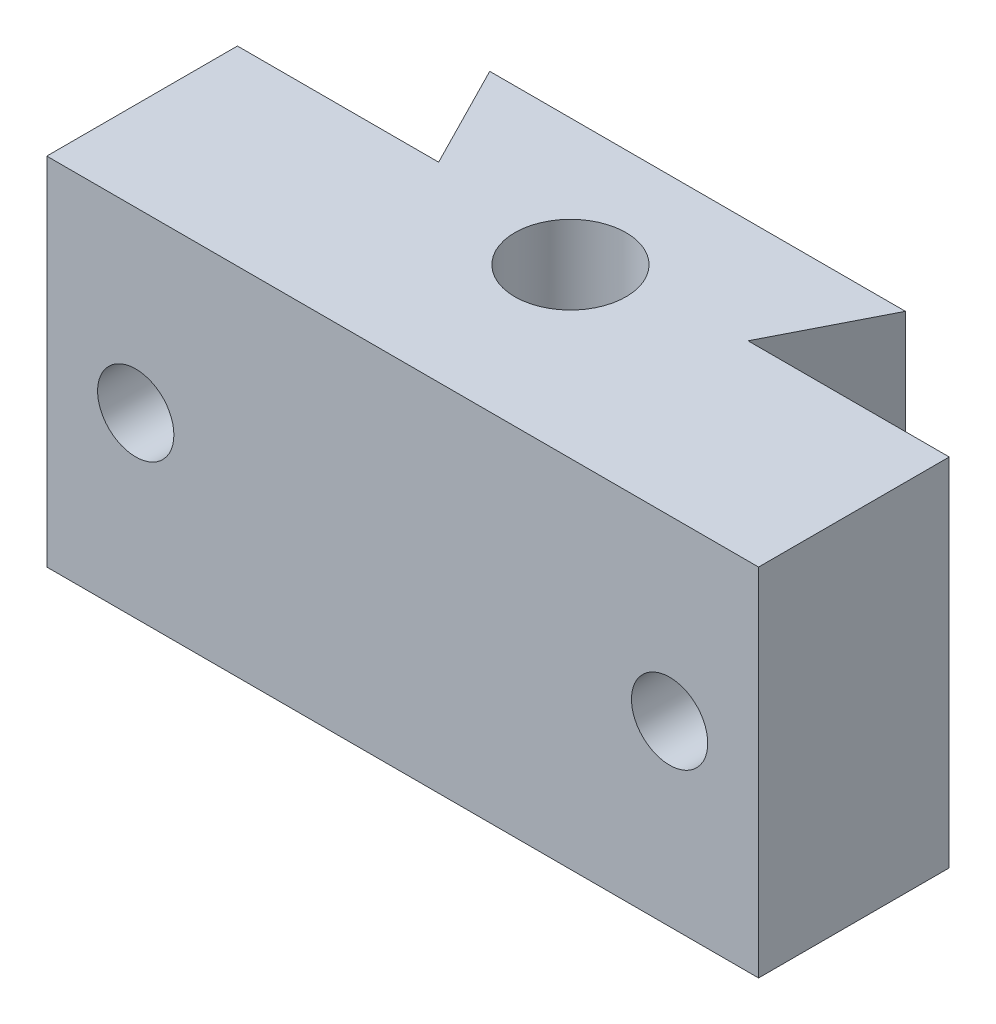
ISO-10303-21;
HEADER;
FILE_DESCRIPTION(('STEP AP214'),'2;1');
FILE_NAME('part.step','',(''),(''),'','','');
FILE_SCHEMA(('AUTOMOTIVE_DESIGN { 1 0 10303 214 1 1 1 1 }'));
ENDSEC;
DATA;
#1=APPLICATION_CONTEXT('core data for automotive mechanical design processes');
#2=APPLICATION_PROTOCOL_DEFINITION('international standard','automotive_design',2000,#1);
#3=PRODUCT_CONTEXT('',#1,'mechanical');
#4=PRODUCT('Part','Part','',(#3));
#5=PRODUCT_RELATED_PRODUCT_CATEGORY('part','',(#4));
#6=PRODUCT_DEFINITION_FORMATION('','',#4);
#7=PRODUCT_DEFINITION_CONTEXT('part definition',#1,'design');
#8=PRODUCT_DEFINITION('design','',#6,#7);
#9=PRODUCT_DEFINITION_SHAPE('','',#8);
#10=(LENGTH_UNIT() NAMED_UNIT(*) SI_UNIT(.MILLI.,.METRE.));
#11=(NAMED_UNIT(*) PLANE_ANGLE_UNIT() SI_UNIT($,.RADIAN.));
#12=(NAMED_UNIT(*) SI_UNIT($,.STERADIAN.) SOLID_ANGLE_UNIT());
#13=UNCERTAINTY_MEASURE_WITH_UNIT(LENGTH_MEASURE(1.E-05),#10,'distance_accuracy_value','');
#14=(GEOMETRIC_REPRESENTATION_CONTEXT(3) GLOBAL_UNCERTAINTY_ASSIGNED_CONTEXT((#13)) GLOBAL_UNIT_ASSIGNED_CONTEXT((#10,
#11,#12)) REPRESENTATION_CONTEXT('',''));
#15=CARTESIAN_POINT('',(0.,0.,0.));
#16=DIRECTION('',(0.,0.,1.));
#17=DIRECTION('',(1.,0.,0.));
#18=AXIS2_PLACEMENT_3D('',#15,#16,#17);
#19=CARTESIAN_POINT('',(0.,14.,-15.7));
#20=DIRECTION('',(0.,0.,-1.));
#21=DIRECTION('',(-1.,0.,0.));
#22=AXIS2_PLACEMENT_3D('',#19,#20,#21);
#23=PLANE('',#22);
#24=DIRECTION('',(1.,0.,0.));
#25=VECTOR('',#24,1.);
#26=CARTESIAN_POINT('',(0.,-14.,-15.7));
#27=LINE('',#26,#25);
#28=CARTESIAN_POINT('',(-16.35,-14.,-15.7));
#29=VERTEX_POINT('',#28);
#30=CARTESIAN_POINT('',(16.35,-14.,-15.7));
#31=VERTEX_POINT('',#30);
#32=EDGE_CURVE('E146',#29,#31,#27,.T.);
#33=ORIENTED_EDGE('',*,*,#32,.F.);
#34=DIRECTION('',(0.,-1.,0.));
#35=VECTOR('',#34,1.);
#36=CARTESIAN_POINT('',(-16.35,14.,-15.7));
#37=LINE('',#36,#35);
#38=CARTESIAN_POINT('',(-16.35,14.,-15.7));
#39=VERTEX_POINT('',#38);
#40=EDGE_CURVE('E43',#39,#29,#37,.T.);
#41=ORIENTED_EDGE('',*,*,#40,.F.);
#42=DIRECTION('',(1.,0.,0.));
#43=VECTOR('',#42,1.);
#44=CARTESIAN_POINT('',(0.,14.,-15.7));
#45=LINE('',#44,#43);
#46=CARTESIAN_POINT('',(16.35,14.,-15.7));
#47=VERTEX_POINT('',#46);
#48=EDGE_CURVE('E219',#39,#47,#45,.T.);
#49=ORIENTED_EDGE('',*,*,#48,.T.);
#50=DIRECTION('',(0.,-1.,0.));
#51=VECTOR('',#50,1.);
#52=CARTESIAN_POINT('',(16.35,14.,-15.7));
#53=LINE('',#52,#51);
#54=EDGE_CURVE('E11',#47,#31,#53,.T.);
#55=ORIENTED_EDGE('',*,*,#54,.T.);
#56=EDGE_LOOP('',(#33,#41,#49,#55));
#57=FACE_BOUND('',#56,.T.);
#58=DIRECTION('',(0.,-1.,0.));
#59=VECTOR('',#58,1.);
#60=CARTESIAN_POINT('',(7.50555349946514,3.375,-15.7));
#61=LINE('',#60,#59);
#62=CARTESIAN_POINT('',(7.50555349946514,3.375,-15.7));
#63=VERTEX_POINT('',#62);
#64=CARTESIAN_POINT('',(7.50555349946514,-3.375,-15.7));
#65=VERTEX_POINT('',#64);
#66=EDGE_CURVE('E178',#63,#65,#61,.T.);
#67=ORIENTED_EDGE('',*,*,#66,.F.);
#68=DIRECTION('',(1.,0.,0.));
#69=VECTOR('',#68,1.);
#70=CARTESIAN_POINT('',(7.50555349946514,3.375,-15.7));
#71=LINE('',#70,#69);
#72=CARTESIAN_POINT('',(-7.50555349946514,3.375,-15.7));
#73=VERTEX_POINT('',#72);
#74=EDGE_CURVE('E478',#73,#63,#71,.T.);
#75=ORIENTED_EDGE('',*,*,#74,.F.);
#76=DIRECTION('',(0.,-1.,0.));
#77=VECTOR('',#76,1.);
#78=CARTESIAN_POINT('',(-7.50555349946514,3.375,-15.7));
#79=LINE('',#78,#77);
#80=CARTESIAN_POINT('',(-7.50555349946514,-3.375,-15.7));
#81=VERTEX_POINT('',#80);
#82=EDGE_CURVE('E184',#73,#81,#79,.T.);
#83=ORIENTED_EDGE('',*,*,#82,.T.);
#84=DIRECTION('',(1.,0.,0.));
#85=VECTOR('',#84,1.);
#86=CARTESIAN_POINT('',(7.50555349946514,-3.375,-15.7));
#87=LINE('',#86,#85);
#88=EDGE_CURVE('E460',#81,#65,#87,.T.);
#89=ORIENTED_EDGE('',*,*,#88,.T.);
#90=EDGE_LOOP('',(#67,#75,#83,#89));
#91=FACE_BOUND('',#90,.T.);
#92=ADVANCED_FACE('F34',(#57,#91),#23,.T.);
#93=CARTESIAN_POINT('',(0.,-14.,-5.7));
#94=DIRECTION('',(0.,1.,0.));
#95=DIRECTION('',(0.,0.,1.));
#96=AXIS2_PLACEMENT_3D('',#93,#94,#95);
#97=CYLINDRICAL_SURFACE('',#96,4.375);
#98=CARTESIAN_POINT('',(0.,14.,-5.7));
#99=DIRECTION('',(0.,1.,0.));
#100=DIRECTION('',(0.,0.,1.));
#101=AXIS2_PLACEMENT_3D('',#98,#99,#100);
#102=CIRCLE('',#101,4.375);
#103=CARTESIAN_POINT('',(0.,14.,-1.325));
#104=VERTEX_POINT('',#103);
#105=EDGE_CURVE('E208',#104,#104,#102,.T.);
#106=ORIENTED_EDGE('',*,*,#105,.T.);
#107=EDGE_LOOP('',(#106));
#108=FACE_BOUND('',#107,.T.);
#109=CARTESIAN_POINT('',(0.,3.375,-5.7));
#110=DIRECTION('',(0.,-1.,0.));
#111=DIRECTION('',(0.,0.,-1.));
#112=AXIS2_PLACEMENT_3D('',#109,#110,#111);
#113=CIRCLE('',#112,4.375);
#114=CARTESIAN_POINT('',(0.,3.375,-10.075));
#115=VERTEX_POINT('',#114);
#116=EDGE_CURVE('E38',#115,#115,#113,.F.);
#117=ORIENTED_EDGE('',*,*,#116,.F.);
#118=EDGE_LOOP('',(#117));
#119=FACE_BOUND('',#118,.T.);
#120=ADVANCED_FACE('F257',(#108,#119),#97,.F.);
#121=CARTESIAN_POINT('',(6.62936103164753,14.,3.3778281595111));
#122=DIRECTION('',(0.891006524188366,0.,0.453990499739551));
#123=DIRECTION('',(0.453990499739551,0.,-0.891006524188366));
#124=AXIS2_PLACEMENT_3D('',#121,#122,#123);
#125=PLANE('',#124);
#126=DIRECTION('',(-0.453990499739551,0.,0.891006524188366));
#127=VECTOR('',#126,1.);
#128=CARTESIAN_POINT('',(6.62936103164753,-14.,3.3778281595111));
#129=LINE('',#128,#127);
#130=CARTESIAN_POINT('',(12.1718913141456,-14.,-7.5));
#131=VERTEX_POINT('',#130);
#132=EDGE_CURVE('E144',#31,#131,#129,.T.);
#133=ORIENTED_EDGE('',*,*,#132,.F.);
#134=ORIENTED_EDGE('',*,*,#54,.F.);
#135=DIRECTION('',(-0.453990499739551,0.,0.891006524188366));
#136=VECTOR('',#135,1.);
#137=CARTESIAN_POINT('',(6.62936103164753,14.,3.3778281595111));
#138=LINE('',#137,#136);
#139=CARTESIAN_POINT('',(12.1718913141456,14.,-7.5));
#140=VERTEX_POINT('',#139);
#141=EDGE_CURVE('E217',#47,#140,#138,.T.);
#142=ORIENTED_EDGE('',*,*,#141,.T.);
#143=DIRECTION('',(0.,-1.,0.));
#144=VECTOR('',#143,1.);
#145=CARTESIAN_POINT('',(12.1718913141456,14.,-7.5));
#146=LINE('',#145,#144);
#147=EDGE_CURVE('E60',#140,#131,#146,.T.);
#148=ORIENTED_EDGE('',*,*,#147,.T.);
#149=EDGE_LOOP('',(#133,#134,#142,#148));
#150=FACE_BOUND('',#149,.T.);
#151=ADVANCED_FACE('F36',(#150),#125,.T.);
#152=CARTESIAN_POINT('',(-6.62936103164753,14.,3.3778281595111));
#153=DIRECTION('',(-0.891006524188366,0.,0.453990499739551));
#154=DIRECTION('',(0.453990499739551,0.,0.891006524188366));
#155=AXIS2_PLACEMENT_3D('',#152,#153,#154);
#156=PLANE('',#155);
#157=DIRECTION('',(-0.453990499739551,0.,-0.891006524188366));
#158=VECTOR('',#157,1.);
#159=CARTESIAN_POINT('',(-6.62936103164753,-14.,3.3778281595111));
#160=LINE('',#159,#158);
#161=CARTESIAN_POINT('',(-12.1718913141456,-14.,-7.5));
#162=VERTEX_POINT('',#161);
#163=EDGE_CURVE('E150',#162,#29,#160,.T.);
#164=ORIENTED_EDGE('',*,*,#163,.F.);
#165=DIRECTION('',(0.,-1.,0.));
#166=VECTOR('',#165,1.);
#167=CARTESIAN_POINT('',(-12.1718913141456,14.,-7.5));
#168=LINE('',#167,#166);
#169=CARTESIAN_POINT('',(-12.1718913141456,14.,-7.5));
#170=VERTEX_POINT('',#169);
#171=EDGE_CURVE('E168',#170,#162,#168,.T.);
#172=ORIENTED_EDGE('',*,*,#171,.F.);
#173=DIRECTION('',(-0.453990499739551,0.,-0.891006524188366));
#174=VECTOR('',#173,1.);
#175=CARTESIAN_POINT('',(-6.62936103164753,14.,3.3778281595111));
#176=LINE('',#175,#174);
#177=EDGE_CURVE('E222',#170,#39,#176,.T.);
#178=ORIENTED_EDGE('',*,*,#177,.T.);
#179=ORIENTED_EDGE('',*,*,#40,.T.);
#180=EDGE_LOOP('',(#164,#172,#178,#179));
#181=FACE_BOUND('',#180,.T.);
#182=ADVANCED_FACE('F240',(#181),#156,.T.);
#183=CARTESIAN_POINT('',(0.,14.,-7.5));
#184=DIRECTION('',(0.,0.,-1.));
#185=DIRECTION('',(-1.,0.,0.));
#186=AXIS2_PLACEMENT_3D('',#183,#184,#185);
#187=PLANE('',#186);
#188=CARTESIAN_POINT('',(-21.,0.,-7.5));
#189=DIRECTION('',(0.,0.,-1.));
#190=DIRECTION('',(-1.,0.,0.));
#191=AXIS2_PLACEMENT_3D('',#188,#189,#190);
#192=CIRCLE('',#191,3.);
#193=CARTESIAN_POINT('',(-18.,0.,-7.5));
#194=VERTEX_POINT('',#193);
#195=EDGE_CURVE('E204',#194,#194,#192,.F.);
#196=ORIENTED_EDGE('',*,*,#195,.T.);
#197=EDGE_LOOP('',(#196));
#198=FACE_BOUND('',#197,.T.);
#199=DIRECTION('',(1.,0.,0.));
#200=VECTOR('',#199,1.);
#201=CARTESIAN_POINT('',(0.,-14.,-7.5));
#202=LINE('',#201,#200);
#203=CARTESIAN_POINT('',(-28.,-14.,-7.5));
#204=VERTEX_POINT('',#203);
#205=EDGE_CURVE('E153',#204,#162,#202,.T.);
#206=ORIENTED_EDGE('',*,*,#205,.F.);
#207=DIRECTION('',(0.,-1.,0.));
#208=VECTOR('',#207,1.);
#209=CARTESIAN_POINT('',(-28.,14.,-7.5));
#210=LINE('',#209,#208);
#211=CARTESIAN_POINT('',(-28.,14.,-7.5));
#212=VERTEX_POINT('',#211);
#213=EDGE_CURVE('E166',#212,#204,#210,.T.);
#214=ORIENTED_EDGE('',*,*,#213,.F.);
#215=DIRECTION('',(1.,0.,0.));
#216=VECTOR('',#215,1.);
#217=CARTESIAN_POINT('',(0.,14.,-7.5));
#218=LINE('',#217,#216);
#219=EDGE_CURVE('E141',#212,#170,#218,.T.);
#220=ORIENTED_EDGE('',*,*,#219,.T.);
#221=ORIENTED_EDGE('',*,*,#171,.T.);
#222=EDGE_LOOP('',(#206,#214,#220,#221));
#223=FACE_BOUND('',#222,.T.);
#224=ADVANCED_FACE('F242',(#198,#223),#187,.T.);
#225=CARTESIAN_POINT('',(-28.,14.,0.));
#226=DIRECTION('',(-1.,0.,0.));
#227=DIRECTION('',(0.,0.,1.));
#228=AXIS2_PLACEMENT_3D('',#225,#226,#227);
#229=PLANE('',#228);
#230=DIRECTION('',(0.,0.,-1.));
#231=VECTOR('',#230,1.);
#232=CARTESIAN_POINT('',(-28.,-14.,0.));
#233=LINE('',#232,#231);
#234=CARTESIAN_POINT('',(-28.,-14.,7.5));
#235=VERTEX_POINT('',#234);
#236=EDGE_CURVE('E156',#235,#204,#233,.T.);
#237=ORIENTED_EDGE('',*,*,#236,.F.);
#238=DIRECTION('',(0.,-1.,0.));
#239=VECTOR('',#238,1.);
#240=CARTESIAN_POINT('',(-28.,14.,7.5));
#241=LINE('',#240,#239);
#242=CARTESIAN_POINT('',(-28.,14.,7.5));
#243=VERTEX_POINT('',#242);
#244=EDGE_CURVE('E134',#243,#235,#241,.T.);
#245=ORIENTED_EDGE('',*,*,#244,.F.);
#246=DIRECTION('',(0.,0.,-1.));
#247=VECTOR('',#246,1.);
#248=CARTESIAN_POINT('',(-28.,14.,0.));
#249=LINE('',#248,#247);
#250=EDGE_CURVE('E123',#243,#212,#249,.T.);
#251=ORIENTED_EDGE('',*,*,#250,.T.);
#252=ORIENTED_EDGE('',*,*,#213,.T.);
#253=EDGE_LOOP('',(#237,#245,#251,#252));
#254=FACE_BOUND('',#253,.T.);
#255=ADVANCED_FACE('F227',(#254),#229,.T.);
#256=CARTESIAN_POINT('',(0.,14.,7.5));
#257=DIRECTION('',(0.,0.,-1.));
#258=DIRECTION('',(-1.,0.,0.));
#259=AXIS2_PLACEMENT_3D('',#256,#257,#258);
#260=PLANE('',#259);
#261=CARTESIAN_POINT('',(-21.,0.,7.5));
#262=DIRECTION('',(0.,0.,1.));
#263=DIRECTION('',(1.,0.,0.));
#264=AXIS2_PLACEMENT_3D('',#261,#262,#263);
#265=CIRCLE('',#264,3.);
#266=CARTESIAN_POINT('',(-18.,0.,7.5));
#267=VERTEX_POINT('',#266);
#268=EDGE_CURVE('E201',#267,#267,#265,.T.);
#269=ORIENTED_EDGE('',*,*,#268,.F.);
#270=EDGE_LOOP('',(#269));
#271=FACE_BOUND('',#270,.T.);
#272=CARTESIAN_POINT('',(21.,0.,7.5));
#273=DIRECTION('',(0.,0.,1.));
#274=DIRECTION('',(1.,0.,0.));
#275=AXIS2_PLACEMENT_3D('',#272,#273,#274);
#276=CIRCLE('',#275,3.);
#277=CARTESIAN_POINT('',(24.,0.,7.5));
#278=VERTEX_POINT('',#277);
#279=EDGE_CURVE('E176',#278,#278,#276,.T.);
#280=ORIENTED_EDGE('',*,*,#279,.F.);
#281=EDGE_LOOP('',(#280));
#282=FACE_BOUND('',#281,.T.);
#283=DIRECTION('',(1.,0.,0.));
#284=VECTOR('',#283,1.);
#285=CARTESIAN_POINT('',(0.,-14.,7.5));
#286=LINE('',#285,#284);
#287=CARTESIAN_POINT('',(28.,-14.,7.5));
#288=VERTEX_POINT('',#287);
#289=EDGE_CURVE('E130',#235,#288,#286,.T.);
#290=ORIENTED_EDGE('',*,*,#289,.T.);
#291=DIRECTION('',(0.,-1.,0.));
#292=VECTOR('',#291,1.);
#293=CARTESIAN_POINT('',(28.,14.,7.5));
#294=LINE('',#293,#292);
#295=CARTESIAN_POINT('',(28.,14.,7.5));
#296=VERTEX_POINT('',#295);
#297=EDGE_CURVE('E127',#296,#288,#294,.T.);
#298=ORIENTED_EDGE('',*,*,#297,.F.);
#299=DIRECTION('',(1.,0.,0.));
#300=VECTOR('',#299,1.);
#301=CARTESIAN_POINT('',(0.,14.,7.5));
#302=LINE('',#301,#300);
#303=EDGE_CURVE('E114',#243,#296,#302,.T.);
#304=ORIENTED_EDGE('',*,*,#303,.F.);
#305=ORIENTED_EDGE('',*,*,#244,.T.);
#306=EDGE_LOOP('',(#290,#298,#304,#305));
#307=FACE_BOUND('',#306,.T.);
#308=ADVANCED_FACE('F128',(#271,#282,#307),#260,.F.);
#309=CARTESIAN_POINT('',(28.,14.,0.));
#310=DIRECTION('',(-1.,0.,0.));
#311=DIRECTION('',(0.,0.,1.));
#312=AXIS2_PLACEMENT_3D('',#309,#310,#311);
#313=PLANE('',#312);
#314=DIRECTION('',(0.,0.,-1.));
#315=VECTOR('',#314,1.);
#316=CARTESIAN_POINT('',(28.,-14.,0.));
#317=LINE('',#316,#315);
#318=CARTESIAN_POINT('',(28.,-14.,-7.5));
#319=VERTEX_POINT('',#318);
#320=EDGE_CURVE('E161',#288,#319,#317,.T.);
#321=ORIENTED_EDGE('',*,*,#320,.T.);
#322=DIRECTION('',(0.,-1.,0.));
#323=VECTOR('',#322,1.);
#324=CARTESIAN_POINT('',(28.,14.,-7.5));
#325=LINE('',#324,#323);
#326=CARTESIAN_POINT('',(28.,14.,-7.5));
#327=VERTEX_POINT('',#326);
#328=EDGE_CURVE('E135',#327,#319,#325,.T.);
#329=ORIENTED_EDGE('',*,*,#328,.F.);
#330=DIRECTION('',(0.,0.,-1.));
#331=VECTOR('',#330,1.);
#332=CARTESIAN_POINT('',(28.,14.,0.));
#333=LINE('',#332,#331);
#334=EDGE_CURVE('E119',#296,#327,#333,.T.);
#335=ORIENTED_EDGE('',*,*,#334,.F.);
#336=ORIENTED_EDGE('',*,*,#297,.T.);
#337=EDGE_LOOP('',(#321,#329,#335,#336));
#338=FACE_BOUND('',#337,.T.);
#339=ADVANCED_FACE('F137',(#338),#313,.F.);
#340=CARTESIAN_POINT('',(21.,0.,-7.5));
#341=DIRECTION('',(0.,0.,-1.));
#342=DIRECTION('',(-1.,0.,0.));
#343=AXIS2_PLACEMENT_3D('',#340,#341,#342);
#344=CIRCLE('',#343,3.);
#345=CARTESIAN_POINT('',(24.,0.,-7.5));
#346=VERTEX_POINT('',#345);
#347=EDGE_CURVE('E205',#346,#346,#344,.F.);
#348=ORIENTED_EDGE('',*,*,#347,.T.);
#349=EDGE_LOOP('',(#348));
#350=FACE_BOUND('',#349,.T.);
#351=EDGE_CURVE('E157',#131,#319,#202,.T.);
#352=ORIENTED_EDGE('',*,*,#351,.F.);
#353=ORIENTED_EDGE('',*,*,#147,.F.);
#354=EDGE_CURVE('E138',#140,#327,#218,.T.);
#355=ORIENTED_EDGE('',*,*,#354,.T.);
#356=ORIENTED_EDGE('',*,*,#328,.T.);
#357=EDGE_LOOP('',(#352,#353,#355,#356));
#358=FACE_BOUND('',#357,.T.);
#359=ADVANCED_FACE('F232',(#350,#358),#187,.T.);
#360=CARTESIAN_POINT('',(0.,14.,0.));
#361=DIRECTION('',(0.,1.,0.));
#362=DIRECTION('',(0.,0.,1.));
#363=AXIS2_PLACEMENT_3D('',#360,#361,#362);
#364=PLANE('',#363);
#365=ORIENTED_EDGE('',*,*,#105,.F.);
#366=EDGE_LOOP('',(#365));
#367=FACE_BOUND('',#366,.T.);
#368=ORIENTED_EDGE('',*,*,#141,.F.);
#369=ORIENTED_EDGE('',*,*,#48,.F.);
#370=ORIENTED_EDGE('',*,*,#177,.F.);
#371=ORIENTED_EDGE('',*,*,#219,.F.);
#372=ORIENTED_EDGE('',*,*,#250,.F.);
#373=ORIENTED_EDGE('',*,*,#303,.T.);
#374=ORIENTED_EDGE('',*,*,#334,.T.);
#375=ORIENTED_EDGE('',*,*,#354,.F.);
#376=EDGE_LOOP('',(#368,#369,#370,#371,#372,#373,#374,#375));
#377=FACE_BOUND('',#376,.T.);
#378=ADVANCED_FACE('F116',(#367,#377),#364,.T.);
#379=CARTESIAN_POINT('',(0.,-14.,0.));
#380=DIRECTION('',(0.,1.,0.));
#381=DIRECTION('',(0.,0.,1.));
#382=AXIS2_PLACEMENT_3D('',#379,#380,#381);
#383=PLANE('',#382);
#384=CARTESIAN_POINT('',(0.,-14.,-5.7));
#385=DIRECTION('',(0.,1.,0.));
#386=DIRECTION('',(0.,0.,1.));
#387=AXIS2_PLACEMENT_3D('',#384,#385,#386);
#388=CIRCLE('',#387,4.375);
#389=CARTESIAN_POINT('',(0.,-14.,-1.325));
#390=VERTEX_POINT('',#389);
#391=EDGE_CURVE('E147',#390,#390,#388,.T.);
#392=ORIENTED_EDGE('',*,*,#391,.T.);
#393=EDGE_LOOP('',(#392));
#394=FACE_BOUND('',#393,.T.);
#395=ORIENTED_EDGE('',*,*,#132,.T.);
#396=ORIENTED_EDGE('',*,*,#351,.T.);
#397=ORIENTED_EDGE('',*,*,#320,.F.);
#398=ORIENTED_EDGE('',*,*,#289,.F.);
#399=ORIENTED_EDGE('',*,*,#236,.T.);
#400=ORIENTED_EDGE('',*,*,#205,.T.);
#401=ORIENTED_EDGE('',*,*,#163,.T.);
#402=ORIENTED_EDGE('',*,*,#32,.T.);
#403=EDGE_LOOP('',(#395,#396,#397,#398,#399,#400,#401,#402));
#404=FACE_BOUND('',#403,.T.);
#405=ADVANCED_FACE('F230',(#394,#404),#383,.F.);
#406=CARTESIAN_POINT('',(0.,-3.375,-5.7));
#407=DIRECTION('',(0.,-1.,0.));
#408=DIRECTION('',(0.,0.,-1.));
#409=AXIS2_PLACEMENT_3D('',#406,#407,#408);
#410=CIRCLE('',#409,4.375);
#411=CARTESIAN_POINT('',(0.,-3.375,-10.075));
#412=VERTEX_POINT('',#411);
#413=EDGE_CURVE('E170',#412,#412,#410,.F.);
#414=ORIENTED_EDGE('',*,*,#413,.T.);
#415=EDGE_LOOP('',(#414));
#416=FACE_BOUND('',#415,.T.);
#417=ORIENTED_EDGE('',*,*,#391,.F.);
#418=EDGE_LOOP('',(#417));
#419=FACE_BOUND('',#418,.T.);
#420=ADVANCED_FACE('F263',(#416,#419),#97,.F.);
#421=CARTESIAN_POINT('',(21.,0.,-15.9852813742386));
#422=DIRECTION('',(0.,0.,1.));
#423=DIRECTION('',(1.,0.,0.));
#424=AXIS2_PLACEMENT_3D('',#421,#422,#423);
#425=CYLINDRICAL_SURFACE('',#424,3.);
#426=CARTESIAN_POINT('',(24.,0.,7.5));
#427=CARTESIAN_POINT('',(24.,0.,7.34375));
#428=CARTESIAN_POINT('',(24.,0.,7.1875));
#429=CARTESIAN_POINT('',(24.,0.,6.875));
#430=CARTESIAN_POINT('',(24.,0.,6.71875));
#431=CARTESIAN_POINT('',(24.,0.,6.40625));
#432=CARTESIAN_POINT('',(24.,0.,6.25));
#433=CARTESIAN_POINT('',(24.,0.,5.9375));
#434=CARTESIAN_POINT('',(24.,0.,5.78125));
#435=CARTESIAN_POINT('',(24.,0.,5.46875));
#436=CARTESIAN_POINT('',(24.,0.,5.3125));
#437=CARTESIAN_POINT('',(24.,0.,5.));
#438=CARTESIAN_POINT('',(24.,0.,4.84375));
#439=CARTESIAN_POINT('',(24.,0.,4.53125));
#440=CARTESIAN_POINT('',(24.,0.,4.375));
#441=CARTESIAN_POINT('',(24.,0.,4.0625));
#442=CARTESIAN_POINT('',(24.,0.,3.90625));
#443=CARTESIAN_POINT('',(24.,0.,3.59375));
#444=CARTESIAN_POINT('',(24.,0.,3.4375));
#445=CARTESIAN_POINT('',(24.,0.,3.125));
#446=CARTESIAN_POINT('',(24.,0.,2.96875));
#447=CARTESIAN_POINT('',(24.,0.,2.65625));
#448=CARTESIAN_POINT('',(24.,0.,2.5));
#449=CARTESIAN_POINT('',(24.,0.,2.1875));
#450=CARTESIAN_POINT('',(24.,0.,2.03125));
#451=CARTESIAN_POINT('',(24.,0.,1.71875));
#452=CARTESIAN_POINT('',(24.,0.,1.5625));
#453=CARTESIAN_POINT('',(24.,0.,1.25));
#454=CARTESIAN_POINT('',(24.,0.,1.09375));
#455=CARTESIAN_POINT('',(24.,0.,0.781250000000001));
#456=CARTESIAN_POINT('',(24.,0.,0.625000000000001));
#457=CARTESIAN_POINT('',(24.,0.,0.312500000000001));
#458=CARTESIAN_POINT('',(24.,0.,0.156250000000002));
#459=CARTESIAN_POINT('',(24.,0.,-0.156249999999997));
#460=CARTESIAN_POINT('',(24.,0.,-0.312499999999997));
#461=CARTESIAN_POINT('',(24.,0.,-0.624999999999997));
#462=CARTESIAN_POINT('',(24.,0.,-0.781249999999997));
#463=CARTESIAN_POINT('',(24.,0.,-1.09375));
#464=CARTESIAN_POINT('',(24.,0.,-1.25));
#465=CARTESIAN_POINT('',(24.,0.,-1.5625));
#466=CARTESIAN_POINT('',(24.,0.,-1.71875));
#467=CARTESIAN_POINT('',(24.,0.,-2.03125));
#468=CARTESIAN_POINT('',(24.,0.,-2.1875));
#469=CARTESIAN_POINT('',(24.,0.,-2.5));
#470=CARTESIAN_POINT('',(24.,0.,-2.65625));
#471=CARTESIAN_POINT('',(24.,0.,-2.96875));
#472=CARTESIAN_POINT('',(24.,0.,-3.125));
#473=CARTESIAN_POINT('',(24.,0.,-3.4375));
#474=CARTESIAN_POINT('',(24.,0.,-3.59375));
#475=CARTESIAN_POINT('',(24.,0.,-3.90625));
#476=CARTESIAN_POINT('',(24.,0.,-4.0625));
#477=CARTESIAN_POINT('',(24.,0.,-4.375));
#478=CARTESIAN_POINT('',(24.,0.,-4.53125));
#479=CARTESIAN_POINT('',(24.,0.,-4.84375));
#480=CARTESIAN_POINT('',(24.,0.,-5.));
#481=CARTESIAN_POINT('',(24.,0.,-5.3125));
#482=CARTESIAN_POINT('',(24.,0.,-5.46875));
#483=CARTESIAN_POINT('',(24.,0.,-5.78125));
#484=CARTESIAN_POINT('',(24.,0.,-5.9375));
#485=CARTESIAN_POINT('',(24.,0.,-6.25));
#486=CARTESIAN_POINT('',(24.,0.,-6.40625));
#487=CARTESIAN_POINT('',(24.,0.,-6.71875));
#488=CARTESIAN_POINT('',(24.,0.,-6.875));
#489=CARTESIAN_POINT('',(24.,0.,-7.1875));
#490=CARTESIAN_POINT('',(24.,0.,-7.34375));
#491=CARTESIAN_POINT('',(24.,0.,-7.5));
#492=B_SPLINE_CURVE_WITH_KNOTS('',3,(#426,#427,#428,#429,#430,#431,#432,#433,#434,#435,#436,
#437,#438,#439,#440,#441,#442,#443,#444,#445,#446,#447,#448,#449,#450,#451,#452,#453,#454,#455,
#456,#457,#458,#459,#460,#461,#462,#463,#464,#465,#466,#467,#468,#469,#470,#471,#472,#473,#474,
#475,#476,#477,#478,#479,#480,#481,#482,#483,#484,#485,#486,#487,#488,#489,#490,#491),
.UNSPECIFIED.,.F.,.F.,(4,2,2,2,2,2,2,2,2,2,2,2,2,2,2,2,2,2,2,2,2,2,2,2,2,2,2,2,2,2,2,2,4),(0.,
0.46875,0.937500000000001,1.40625,1.875,2.34375,2.8125,3.28125,3.75,4.21875,4.6875,5.15625,
5.625,6.09375,6.5625,7.03125,7.5,7.96875,8.4375,8.90625,9.375,9.84375,10.3125,10.78125,11.25,
11.71875,12.1875,12.65625,13.125,13.59375,14.0625,14.53125,15.),.UNSPECIFIED.);
#493=EDGE_CURVE('BSEAM297',#278,#346,#492,.T.);
#494=ORIENTED_EDGE('',*,*,#279,.T.);
#495=ORIENTED_EDGE('',*,*,#347,.F.);
#496=ORIENTED_EDGE('',*,*,#493,.T.);
#497=ORIENTED_EDGE('',*,*,#493,.F.);
#498=EDGE_LOOP('',(#494,#496,#495,#497));
#499=FACE_BOUND('',#498,.T.);
#500=ADVANCED_FACE('F297',(#499),#425,.F.);
#501=CARTESIAN_POINT('',(-21.,0.,-15.9852813742386));
#502=DIRECTION('',(0.,0.,1.));
#503=DIRECTION('',(1.,0.,0.));
#504=AXIS2_PLACEMENT_3D('',#501,#502,#503);
#505=CYLINDRICAL_SURFACE('',#504,3.);
#506=CARTESIAN_POINT('',(-18.,0.,7.5));
#507=CARTESIAN_POINT('',(-18.,0.,7.34375));
#508=CARTESIAN_POINT('',(-18.,0.,7.1875));
#509=CARTESIAN_POINT('',(-18.,0.,6.875));
#510=CARTESIAN_POINT('',(-18.,0.,6.71875));
#511=CARTESIAN_POINT('',(-18.,0.,6.40625));
#512=CARTESIAN_POINT('',(-18.,0.,6.25));
#513=CARTESIAN_POINT('',(-18.,0.,5.9375));
#514=CARTESIAN_POINT('',(-18.,0.,5.78125));
#515=CARTESIAN_POINT('',(-18.,0.,5.46875));
#516=CARTESIAN_POINT('',(-18.,0.,5.3125));
#517=CARTESIAN_POINT('',(-18.,0.,5.));
#518=CARTESIAN_POINT('',(-18.,0.,4.84375));
#519=CARTESIAN_POINT('',(-18.,0.,4.53125));
#520=CARTESIAN_POINT('',(-18.,0.,4.375));
#521=CARTESIAN_POINT('',(-18.,0.,4.0625));
#522=CARTESIAN_POINT('',(-18.,0.,3.90625));
#523=CARTESIAN_POINT('',(-18.,0.,3.59375));
#524=CARTESIAN_POINT('',(-18.,0.,3.4375));
#525=CARTESIAN_POINT('',(-18.,0.,3.125));
#526=CARTESIAN_POINT('',(-18.,0.,2.96875));
#527=CARTESIAN_POINT('',(-18.,0.,2.65625));
#528=CARTESIAN_POINT('',(-18.,0.,2.5));
#529=CARTESIAN_POINT('',(-18.,0.,2.1875));
#530=CARTESIAN_POINT('',(-18.,0.,2.03125));
#531=CARTESIAN_POINT('',(-18.,0.,1.71875));
#532=CARTESIAN_POINT('',(-18.,0.,1.5625));
#533=CARTESIAN_POINT('',(-18.,0.,1.25));
#534=CARTESIAN_POINT('',(-18.,0.,1.09375));
#535=CARTESIAN_POINT('',(-18.,0.,0.781250000000001));
#536=CARTESIAN_POINT('',(-18.,0.,0.625000000000001));
#537=CARTESIAN_POINT('',(-18.,0.,0.312500000000001));
#538=CARTESIAN_POINT('',(-18.,0.,0.156250000000002));
#539=CARTESIAN_POINT('',(-18.,0.,-0.156249999999997));
#540=CARTESIAN_POINT('',(-18.,0.,-0.312499999999997));
#541=CARTESIAN_POINT('',(-18.,0.,-0.624999999999997));
#542=CARTESIAN_POINT('',(-18.,0.,-0.781249999999997));
#543=CARTESIAN_POINT('',(-18.,0.,-1.09375));
#544=CARTESIAN_POINT('',(-18.,0.,-1.25));
#545=CARTESIAN_POINT('',(-18.,0.,-1.5625));
#546=CARTESIAN_POINT('',(-18.,0.,-1.71875));
#547=CARTESIAN_POINT('',(-18.,0.,-2.03125));
#548=CARTESIAN_POINT('',(-18.,0.,-2.1875));
#549=CARTESIAN_POINT('',(-18.,0.,-2.5));
#550=CARTESIAN_POINT('',(-18.,0.,-2.65625));
#551=CARTESIAN_POINT('',(-18.,0.,-2.96875));
#552=CARTESIAN_POINT('',(-18.,0.,-3.125));
#553=CARTESIAN_POINT('',(-18.,0.,-3.4375));
#554=CARTESIAN_POINT('',(-18.,0.,-3.59375));
#555=CARTESIAN_POINT('',(-18.,0.,-3.90625));
#556=CARTESIAN_POINT('',(-18.,0.,-4.0625));
#557=CARTESIAN_POINT('',(-18.,0.,-4.375));
#558=CARTESIAN_POINT('',(-18.,0.,-4.53125));
#559=CARTESIAN_POINT('',(-18.,0.,-4.84375));
#560=CARTESIAN_POINT('',(-18.,0.,-5.));
#561=CARTESIAN_POINT('',(-18.,0.,-5.3125));
#562=CARTESIAN_POINT('',(-18.,0.,-5.46875));
#563=CARTESIAN_POINT('',(-18.,0.,-5.78125));
#564=CARTESIAN_POINT('',(-18.,0.,-5.9375));
#565=CARTESIAN_POINT('',(-18.,0.,-6.25));
#566=CARTESIAN_POINT('',(-18.,0.,-6.40625));
#567=CARTESIAN_POINT('',(-18.,0.,-6.71875));
#568=CARTESIAN_POINT('',(-18.,0.,-6.875));
#569=CARTESIAN_POINT('',(-18.,0.,-7.1875));
#570=CARTESIAN_POINT('',(-18.,0.,-7.34375));
#571=CARTESIAN_POINT('',(-18.,0.,-7.5));
#572=B_SPLINE_CURVE_WITH_KNOTS('',3,(#506,#507,#508,#509,#510,#511,#512,#513,#514,#515,#516,
#517,#518,#519,#520,#521,#522,#523,#524,#525,#526,#527,#528,#529,#530,#531,#532,#533,#534,#535,
#536,#537,#538,#539,#540,#541,#542,#543,#544,#545,#546,#547,#548,#549,#550,#551,#552,#553,#554,
#555,#556,#557,#558,#559,#560,#561,#562,#563,#564,#565,#566,#567,#568,#569,#570,#571),
.UNSPECIFIED.,.F.,.F.,(4,2,2,2,2,2,2,2,2,2,2,2,2,2,2,2,2,2,2,2,2,2,2,2,2,2,2,2,2,2,2,2,4),(0.,
0.46875,0.937500000000001,1.40625,1.875,2.34375,2.8125,3.28125,3.75,4.21875,4.6875,5.15625,
5.625,6.09375,6.5625,7.03125,7.5,7.96875,8.4375,8.90625,9.375,9.84375,10.3125,10.78125,11.25,
11.71875,12.1875,12.65625,13.125,13.59375,14.0625,14.53125,15.),.UNSPECIFIED.);
#573=EDGE_CURVE('BSEAM304',#267,#194,#572,.T.);
#574=ORIENTED_EDGE('',*,*,#268,.T.);
#575=ORIENTED_EDGE('',*,*,#195,.F.);
#576=ORIENTED_EDGE('',*,*,#573,.T.);
#577=ORIENTED_EDGE('',*,*,#573,.F.);
#578=EDGE_LOOP('',(#574,#576,#575,#577));
#579=FACE_BOUND('',#578,.T.);
#580=ADVANCED_FACE('F304',(#579),#505,.F.);
#581=CARTESIAN_POINT('',(0.,3.375,0.));
#582=DIRECTION('',(0.,-1.,0.));
#583=DIRECTION('',(0.,0.,-1.));
#584=AXIS2_PLACEMENT_3D('',#581,#582,#583);
#585=PLANE('',#584);
#586=DIRECTION('',(-0.5,0.,0.866025403784439));
#587=VECTOR('',#586,1.);
#588=CARTESIAN_POINT('',(7.50555349946514,3.375,-5.70000000000001));
#589=LINE('',#588,#587);
#590=CARTESIAN_POINT('',(7.50555349946514,3.375,-5.70000000000001));
#591=VERTEX_POINT('',#590);
#592=CARTESIAN_POINT('',(3.75277674973257,3.375,0.799999999999996));
#593=VERTEX_POINT('',#592);
#594=EDGE_CURVE('E463',#591,#593,#589,.T.);
#595=ORIENTED_EDGE('',*,*,#594,.T.);
#596=DIRECTION('',(-1.,0.,0.));
#597=VECTOR('',#596,1.);
#598=CARTESIAN_POINT('',(3.75277674973257,3.375,0.799999999999996));
#599=LINE('',#598,#597);
#600=CARTESIAN_POINT('',(-3.75277674973257,3.375,0.799999999999998));
#601=VERTEX_POINT('',#600);
#602=EDGE_CURVE('E465',#593,#601,#599,.T.);
#603=ORIENTED_EDGE('',*,*,#602,.T.);
#604=DIRECTION('',(-0.5,0.,-0.866025403784439));
#605=VECTOR('',#604,1.);
#606=CARTESIAN_POINT('',(-3.75277674973257,3.375,0.799999999999998));
#607=LINE('',#606,#605);
#608=CARTESIAN_POINT('',(-7.50555349946514,3.375,-5.70000000000001));
#609=VERTEX_POINT('',#608);
#610=EDGE_CURVE('E470',#601,#609,#607,.T.);
#611=ORIENTED_EDGE('',*,*,#610,.T.);
#612=DIRECTION('',(0.,0.,-1.));
#613=VECTOR('',#612,1.);
#614=CARTESIAN_POINT('',(-7.50555349946514,3.375,-5.70000000000001));
#615=LINE('',#614,#613);
#616=EDGE_CURVE('E475',#609,#73,#615,.T.);
#617=ORIENTED_EDGE('',*,*,#616,.T.);
#618=ORIENTED_EDGE('',*,*,#74,.T.);
#619=DIRECTION('',(0.,0.,1.));
#620=VECTOR('',#619,1.);
#621=CARTESIAN_POINT('',(7.50555349946514,3.375,-5.70000000000001));
#622=LINE('',#621,#620);
#623=EDGE_CURVE('E200',#63,#591,#622,.T.);
#624=ORIENTED_EDGE('',*,*,#623,.T.);
#625=EDGE_LOOP('',(#595,#603,#611,#617,#618,#624));
#626=FACE_BOUND('',#625,.T.);
#627=ORIENTED_EDGE('',*,*,#116,.T.);
#628=EDGE_LOOP('',(#627));
#629=FACE_BOUND('',#628,.T.);
#630=ADVANCED_FACE('F312',(#626,#629),#585,.T.);
#631=CARTESIAN_POINT('',(0.,-3.375,0.));
#632=DIRECTION('',(0.,-1.,0.));
#633=DIRECTION('',(0.,0.,-1.));
#634=AXIS2_PLACEMENT_3D('',#631,#632,#633);
#635=PLANE('',#634);
#636=DIRECTION('',(-0.5,0.,0.866025403784439));
#637=VECTOR('',#636,1.);
#638=CARTESIAN_POINT('',(7.50555349946514,-3.375,-5.70000000000001));
#639=LINE('',#638,#637);
#640=CARTESIAN_POINT('',(7.50555349946514,-3.375,-5.70000000000001));
#641=VERTEX_POINT('',#640);
#642=CARTESIAN_POINT('',(3.75277674973257,-3.375,0.799999999999996));
#643=VERTEX_POINT('',#642);
#644=EDGE_CURVE('E451',#641,#643,#639,.T.);
#645=ORIENTED_EDGE('',*,*,#644,.F.);
#646=DIRECTION('',(0.,0.,1.));
#647=VECTOR('',#646,1.);
#648=CARTESIAN_POINT('',(7.50555349946514,-3.375,-5.70000000000001));
#649=LINE('',#648,#647);
#650=EDGE_CURVE('E51',#65,#641,#649,.T.);
#651=ORIENTED_EDGE('',*,*,#650,.F.);
#652=ORIENTED_EDGE('',*,*,#88,.F.);
#653=DIRECTION('',(0.,0.,-1.));
#654=VECTOR('',#653,1.);
#655=CARTESIAN_POINT('',(-7.50555349946514,-3.375,-5.70000000000001));
#656=LINE('',#655,#654);
#657=CARTESIAN_POINT('',(-7.50555349946514,-3.375,-5.70000000000001));
#658=VERTEX_POINT('',#657);
#659=EDGE_CURVE('E454',#658,#81,#656,.T.);
#660=ORIENTED_EDGE('',*,*,#659,.F.);
#661=DIRECTION('',(-0.5,0.,-0.866025403784439));
#662=VECTOR('',#661,1.);
#663=CARTESIAN_POINT('',(-3.75277674973257,-3.375,0.799999999999998));
#664=LINE('',#663,#662);
#665=CARTESIAN_POINT('',(-3.75277674973257,-3.375,0.799999999999998));
#666=VERTEX_POINT('',#665);
#667=EDGE_CURVE('E450',#666,#658,#664,.T.);
#668=ORIENTED_EDGE('',*,*,#667,.F.);
#669=DIRECTION('',(-1.,0.,0.));
#670=VECTOR('',#669,1.);
#671=CARTESIAN_POINT('',(3.75277674973257,-3.375,0.799999999999996));
#672=LINE('',#671,#670);
#673=EDGE_CURVE('E441',#643,#666,#672,.T.);
#674=ORIENTED_EDGE('',*,*,#673,.F.);
#675=EDGE_LOOP('',(#645,#651,#652,#660,#668,#674));
#676=FACE_BOUND('',#675,.T.);
#677=ORIENTED_EDGE('',*,*,#413,.F.);
#678=EDGE_LOOP('',(#677));
#679=FACE_BOUND('',#678,.T.);
#680=ADVANCED_FACE('F319',(#676,#679),#635,.F.);
#681=CARTESIAN_POINT('',(7.50555349946514,3.375,-5.70000000000001));
#682=DIRECTION('',(0.866025403784439,0.,0.5));
#683=DIRECTION('',(0.5,0.,-0.866025403784439));
#684=AXIS2_PLACEMENT_3D('',#681,#682,#683);
#685=PLANE('',#684);
#686=ORIENTED_EDGE('',*,*,#644,.T.);
#687=DIRECTION('',(0.,-1.,0.));
#688=VECTOR('',#687,1.);
#689=CARTESIAN_POINT('',(3.75277674973257,3.375,0.799999999999996));
#690=LINE('',#689,#688);
#691=EDGE_CURVE('E197',#593,#643,#690,.T.);
#692=ORIENTED_EDGE('',*,*,#691,.F.);
#693=ORIENTED_EDGE('',*,*,#594,.F.);
#694=DIRECTION('',(0.,-1.,0.));
#695=VECTOR('',#694,1.);
#696=CARTESIAN_POINT('',(7.50555349946514,3.375,-5.70000000000001));
#697=LINE('',#696,#695);
#698=EDGE_CURVE('E172',#591,#641,#697,.T.);
#699=ORIENTED_EDGE('',*,*,#698,.T.);
#700=EDGE_LOOP('',(#686,#692,#693,#699));
#701=FACE_BOUND('',#700,.T.);
#702=ADVANCED_FACE('F327',(#701),#685,.F.);
#703=CARTESIAN_POINT('',(7.50555349946514,3.375,-5.70000000000001));
#704=DIRECTION('',(1.,0.,0.));
#705=DIRECTION('',(0.,0.,-1.));
#706=AXIS2_PLACEMENT_3D('',#703,#704,#705);
#707=PLANE('',#706);
#708=ORIENTED_EDGE('',*,*,#650,.T.);
#709=ORIENTED_EDGE('',*,*,#698,.F.);
#710=ORIENTED_EDGE('',*,*,#623,.F.);
#711=ORIENTED_EDGE('',*,*,#66,.T.);
#712=EDGE_LOOP('',(#708,#709,#710,#711));
#713=FACE_BOUND('',#712,.T.);
#714=ADVANCED_FACE('F334',(#713),#707,.F.);
#715=CARTESIAN_POINT('',(-7.50555349946514,3.375,-5.70000000000001));
#716=DIRECTION('',(-1.,0.,0.));
#717=DIRECTION('',(0.,0.,1.));
#718=AXIS2_PLACEMENT_3D('',#715,#716,#717);
#719=PLANE('',#718);
#720=ORIENTED_EDGE('',*,*,#659,.T.);
#721=ORIENTED_EDGE('',*,*,#82,.F.);
#722=ORIENTED_EDGE('',*,*,#616,.F.);
#723=DIRECTION('',(0.,-1.,0.));
#724=VECTOR('',#723,1.);
#725=CARTESIAN_POINT('',(-7.50555349946514,3.375,-5.70000000000001));
#726=LINE('',#725,#724);
#727=EDGE_CURVE('E191',#609,#658,#726,.T.);
#728=ORIENTED_EDGE('',*,*,#727,.T.);
#729=EDGE_LOOP('',(#720,#721,#722,#728));
#730=FACE_BOUND('',#729,.T.);
#731=ADVANCED_FACE('F341',(#730),#719,.F.);
#732=CARTESIAN_POINT('',(-3.75277674973257,3.375,0.799999999999998));
#733=DIRECTION('',(-0.866025403784439,0.,0.5));
#734=DIRECTION('',(0.5,0.,0.866025403784439));
#735=AXIS2_PLACEMENT_3D('',#732,#733,#734);
#736=PLANE('',#735);
#737=ORIENTED_EDGE('',*,*,#667,.T.);
#738=ORIENTED_EDGE('',*,*,#727,.F.);
#739=ORIENTED_EDGE('',*,*,#610,.F.);
#740=DIRECTION('',(0.,-1.,0.));
#741=VECTOR('',#740,1.);
#742=CARTESIAN_POINT('',(-3.75277674973257,3.375,0.799999999999998));
#743=LINE('',#742,#741);
#744=EDGE_CURVE('E194',#601,#666,#743,.T.);
#745=ORIENTED_EDGE('',*,*,#744,.T.);
#746=EDGE_LOOP('',(#737,#738,#739,#745));
#747=FACE_BOUND('',#746,.T.);
#748=ADVANCED_FACE('F349',(#747),#736,.F.);
#749=CARTESIAN_POINT('',(3.75277674973257,3.375,0.799999999999996));
#750=DIRECTION('',(0.,0.,1.));
#751=DIRECTION('',(1.,0.,0.));
#752=AXIS2_PLACEMENT_3D('',#749,#750,#751);
#753=PLANE('',#752);
#754=ORIENTED_EDGE('',*,*,#673,.T.);
#755=ORIENTED_EDGE('',*,*,#744,.F.);
#756=ORIENTED_EDGE('',*,*,#602,.F.);
#757=ORIENTED_EDGE('',*,*,#691,.T.);
#758=EDGE_LOOP('',(#754,#755,#756,#757));
#759=FACE_BOUND('',#758,.T.);
#760=ADVANCED_FACE('F357',(#759),#753,.F.);
#761=CLOSED_SHELL('',(#92,#120,#151,#182,#224,#255,#308,#339,#359,#378,#405,#420,#500,#580,#630,
#680,#702,#714,#731,#748,#760));
#762=MANIFOLD_SOLID_BREP('B2',#761);
#763=ADVANCED_BREP_SHAPE_REPRESENTATION('',(#18,#762),#14);
#764=SHAPE_DEFINITION_REPRESENTATION(#9,#763);
ENDSEC;
END-ISO-10303-21;
